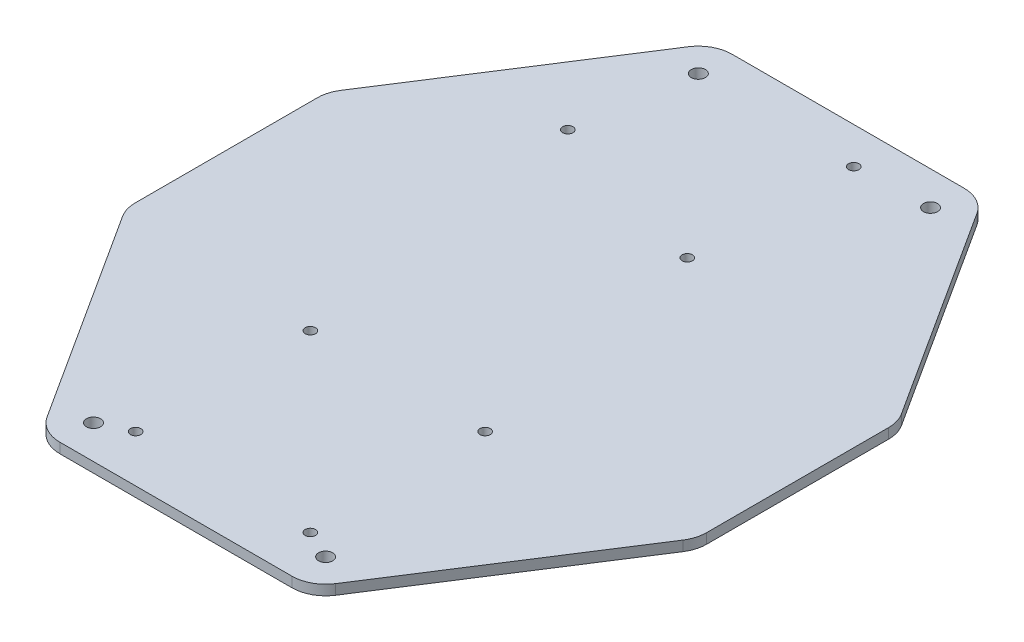
ISO-10303-21;
HEADER;
FILE_DESCRIPTION(('STEP AP214'),'2;1');
FILE_NAME('part.step','',(''),(''),'','','');
FILE_SCHEMA(('AUTOMOTIVE_DESIGN { 1 0 10303 214 1 1 1 1 }'));
ENDSEC;
DATA;
#1=APPLICATION_CONTEXT('core data for automotive mechanical design processes');
#2=APPLICATION_PROTOCOL_DEFINITION('international standard','automotive_design',2000,#1);
#3=PRODUCT_CONTEXT('',#1,'mechanical');
#4=PRODUCT('Part','Part','',(#3));
#5=PRODUCT_RELATED_PRODUCT_CATEGORY('part','',(#4));
#6=PRODUCT_DEFINITION_FORMATION('','',#4);
#7=PRODUCT_DEFINITION_CONTEXT('part definition',#1,'design');
#8=PRODUCT_DEFINITION('design','',#6,#7);
#9=PRODUCT_DEFINITION_SHAPE('','',#8);
#10=(LENGTH_UNIT() NAMED_UNIT(*) SI_UNIT(.MILLI.,.METRE.));
#11=(NAMED_UNIT(*) PLANE_ANGLE_UNIT() SI_UNIT($,.RADIAN.));
#12=(NAMED_UNIT(*) SI_UNIT($,.STERADIAN.) SOLID_ANGLE_UNIT());
#13=UNCERTAINTY_MEASURE_WITH_UNIT(LENGTH_MEASURE(1.E-05),#10,'distance_accuracy_value','');
#14=(GEOMETRIC_REPRESENTATION_CONTEXT(3) GLOBAL_UNCERTAINTY_ASSIGNED_CONTEXT((#13)) GLOBAL_UNIT_ASSIGNED_CONTEXT((#10,
#11,#12)) REPRESENTATION_CONTEXT('',''));
#15=CARTESIAN_POINT('',(0.,0.,0.));
#16=DIRECTION('',(0.,0.,1.));
#17=DIRECTION('',(1.,0.,0.));
#18=AXIS2_PLACEMENT_3D('',#15,#16,#17);
#19=CARTESIAN_POINT('',(-75.,3.,-32.9370188634369));
#20=DIRECTION('',(0.,1.,0.));
#21=DIRECTION('',(0.,0.,1.));
#22=AXIS2_PLACEMENT_3D('',#19,#20,#21);
#23=PLANE('',#22);
#24=CARTESIAN_POINT('',(34.5404878735048,3.,-150.));
#25=DIRECTION('',(0.,1.,0.));
#26=DIRECTION('',(0.,0.,1.));
#27=AXIS2_PLACEMENT_3D('',#24,#25,#26);
#28=CIRCLE('',#27,2.09999999999999);
#29=CARTESIAN_POINT('',(34.5404878735048,3.,-147.9));
#30=VERTEX_POINT('',#29);
#31=EDGE_CURVE('E430',#30,#30,#28,.T.);
#32=ORIENTED_EDGE('',*,*,#31,.F.);
#33=EDGE_LOOP('',(#32));
#34=FACE_BOUND('',#33,.T.);
#35=CARTESIAN_POINT('',(-34.5404878735048,3.,30.));
#36=DIRECTION('',(0.,1.,0.));
#37=DIRECTION('',(0.,0.,1.));
#38=AXIS2_PLACEMENT_3D('',#35,#36,#37);
#39=CIRCLE('',#38,2.1);
#40=CARTESIAN_POINT('',(-34.5404878735048,3.,32.1));
#41=VERTEX_POINT('',#40);
#42=EDGE_CURVE('E446',#41,#41,#39,.T.);
#43=ORIENTED_EDGE('',*,*,#42,.F.);
#44=EDGE_LOOP('',(#43));
#45=FACE_BOUND('',#44,.T.);
#46=CARTESIAN_POINT('',(11.3,3.,-100.87));
#47=DIRECTION('',(0.,1.,0.));
#48=DIRECTION('',(0.,0.,1.));
#49=AXIS2_PLACEMENT_3D('',#46,#47,#48);
#50=CIRCLE('',#49,1.55);
#51=CARTESIAN_POINT('',(11.3,3.,-99.32));
#52=VERTEX_POINT('',#51);
#53=EDGE_CURVE('E462',#52,#52,#50,.T.);
#54=ORIENTED_EDGE('',*,*,#53,.F.);
#55=EDGE_LOOP('',(#54));
#56=FACE_BOUND('',#55,.T.);
#57=CARTESIAN_POINT('',(-26.0000000000003,3.,25.9999999999997));
#58=DIRECTION('',(0.,1.,0.));
#59=DIRECTION('',(0.,0.,1.));
#60=AXIS2_PLACEMENT_3D('',#57,#58,#59);
#61=CIRCLE('',#60,1.55);
#62=CARTESIAN_POINT('',(-26.0000000000003,3.,27.5499999999997));
#63=VERTEX_POINT('',#62);
#64=EDGE_CURVE('E478',#63,#63,#61,.T.);
#65=ORIENTED_EDGE('',*,*,#64,.F.);
#66=EDGE_LOOP('',(#65));
#67=FACE_BOUND('',#66,.T.);
#68=CARTESIAN_POINT('',(26.0000000000001,3.,-25.9999999999999));
#69=DIRECTION('',(0.,1.,0.));
#70=DIRECTION('',(0.,0.,1.));
#71=AXIS2_PLACEMENT_3D('',#68,#69,#70);
#72=CIRCLE('',#71,1.55);
#73=CARTESIAN_POINT('',(26.0000000000001,3.,-24.4499999999999));
#74=VERTEX_POINT('',#73);
#75=EDGE_CURVE('E494',#74,#74,#72,.T.);
#76=ORIENTED_EDGE('',*,*,#75,.F.);
#77=EDGE_LOOP('',(#76));
#78=FACE_BOUND('',#77,.T.);
#79=CARTESIAN_POINT('',(-75.,3.,-32.9370188634369));
#80=DIRECTION('',(0.,1.,0.));
#81=DIRECTION('',(0.,0.,1.));
#82=AXIS2_PLACEMENT_3D('',#79,#80,#81);
#83=CIRCLE('',#82,10.);
#84=CARTESIAN_POINT('',(-85.,3.,-32.937018863437));
#85=VERTEX_POINT('',#84);
#86=CARTESIAN_POINT('',(-83.4117847537655,3.,-27.5294429503019));
#87=VERTEX_POINT('',#86);
#88=EDGE_CURVE('E242',#85,#87,#83,.T.);
#89=ORIENTED_EDGE('',*,*,#88,.T.);
#90=DIRECTION('',(0.540757591313499,0.,0.841178475376554));
#91=VECTOR('',#90,1.);
#92=CARTESIAN_POINT('',(-83.4117847537655,3.,-27.5294429503019));
#93=LINE('',#92,#91);
#94=CARTESIAN_POINT('',(-42.9522726272704,3.,35.407575913135));
#95=VERTEX_POINT('',#94);
#96=EDGE_CURVE('E130',#87,#95,#93,.T.);
#97=ORIENTED_EDGE('',*,*,#96,.T.);
#98=CARTESIAN_POINT('',(-34.5404878735048,3.,30.));
#99=DIRECTION('',(0.,1.,0.));
#100=DIRECTION('',(0.,0.,-1.));
#101=AXIS2_PLACEMENT_3D('',#98,#99,#100);
#102=CIRCLE('',#101,10.);
#103=CARTESIAN_POINT('',(-34.5404878735048,3.,40.));
#104=VERTEX_POINT('',#103);
#105=EDGE_CURVE('E295',#95,#104,#102,.T.);
#106=ORIENTED_EDGE('',*,*,#105,.T.);
#107=DIRECTION('',(1.,0.,0.));
#108=VECTOR('',#107,1.);
#109=CARTESIAN_POINT('',(-34.5404878735048,3.,40.));
#110=LINE('',#109,#108);
#111=CARTESIAN_POINT('',(34.5404878735048,3.,40.));
#112=VERTEX_POINT('',#111);
#113=EDGE_CURVE('E315',#104,#112,#110,.T.);
#114=ORIENTED_EDGE('',*,*,#113,.T.);
#115=CARTESIAN_POINT('',(34.5404878735048,3.,30.));
#116=DIRECTION('',(0.,1.,0.));
#117=DIRECTION('',(0.,0.,1.));
#118=AXIS2_PLACEMENT_3D('',#115,#116,#117);
#119=CIRCLE('',#118,10.);
#120=CARTESIAN_POINT('',(42.9522726272704,3.,35.407575913135));
#121=VERTEX_POINT('',#120);
#122=EDGE_CURVE('E311',#112,#121,#119,.T.);
#123=ORIENTED_EDGE('',*,*,#122,.T.);
#124=DIRECTION('',(0.540757591313499,0.,-0.841178475376554));
#125=VECTOR('',#124,1.);
#126=CARTESIAN_POINT('',(83.4117847537655,3.,-27.5294429503019));
#127=LINE('',#126,#125);
#128=CARTESIAN_POINT('',(83.4117847537655,3.,-27.5294429503019));
#129=VERTEX_POINT('',#128);
#130=EDGE_CURVE('E314',#121,#129,#127,.T.);
#131=ORIENTED_EDGE('',*,*,#130,.T.);
#132=CARTESIAN_POINT('',(75.,3.,-32.9370188634369));
#133=DIRECTION('',(0.,1.,0.));
#134=DIRECTION('',(0.,0.,-1.));
#135=AXIS2_PLACEMENT_3D('',#132,#133,#134);
#136=CIRCLE('',#135,10.);
#137=CARTESIAN_POINT('',(85.,3.,-32.937018863437));
#138=VERTEX_POINT('',#137);
#139=EDGE_CURVE('E319',#129,#138,#136,.T.);
#140=ORIENTED_EDGE('',*,*,#139,.T.);
#141=DIRECTION('',(0.,0.,-1.));
#142=VECTOR('',#141,1.);
#143=CARTESIAN_POINT('',(85.,3.,-32.937018863437));
#144=LINE('',#143,#142);
#145=CARTESIAN_POINT('',(85.,3.,-87.062981136563));
#146=VERTEX_POINT('',#145);
#147=EDGE_CURVE('E326',#138,#146,#144,.T.);
#148=ORIENTED_EDGE('',*,*,#147,.T.);
#149=CARTESIAN_POINT('',(75.,3.,-87.0629811365631));
#150=DIRECTION('',(0.,1.,0.));
#151=DIRECTION('',(0.,0.,1.));
#152=AXIS2_PLACEMENT_3D('',#149,#150,#151);
#153=CIRCLE('',#152,10.);
#154=CARTESIAN_POINT('',(83.4117847537655,3.,-92.4705570496981));
#155=VERTEX_POINT('',#154);
#156=EDGE_CURVE('E329',#146,#155,#153,.T.);
#157=ORIENTED_EDGE('',*,*,#156,.T.);
#158=DIRECTION('',(-0.540757591313499,0.,-0.841178475376554));
#159=VECTOR('',#158,1.);
#160=CARTESIAN_POINT('',(42.9522726272704,3.,-155.407575913135));
#161=LINE('',#160,#159);
#162=CARTESIAN_POINT('',(42.9522726272704,3.,-155.407575913135));
#163=VERTEX_POINT('',#162);
#164=EDGE_CURVE('E332',#155,#163,#161,.T.);
#165=ORIENTED_EDGE('',*,*,#164,.T.);
#166=CARTESIAN_POINT('',(34.5404878735048,3.,-150.));
#167=DIRECTION('',(0.,1.,0.));
#168=DIRECTION('',(0.,0.,-1.));
#169=AXIS2_PLACEMENT_3D('',#166,#167,#168);
#170=CIRCLE('',#169,10.);
#171=CARTESIAN_POINT('',(34.5404878735048,3.,-160.));
#172=VERTEX_POINT('',#171);
#173=EDGE_CURVE('E335',#163,#172,#170,.T.);
#174=ORIENTED_EDGE('',*,*,#173,.T.);
#175=DIRECTION('',(-1.,0.,0.));
#176=VECTOR('',#175,1.);
#177=CARTESIAN_POINT('',(-34.5404878735048,3.,-160.));
#178=LINE('',#177,#176);
#179=CARTESIAN_POINT('',(-34.5404878735048,3.,-160.));
#180=VERTEX_POINT('',#179);
#181=EDGE_CURVE('E338',#172,#180,#178,.T.);
#182=ORIENTED_EDGE('',*,*,#181,.T.);
#183=CARTESIAN_POINT('',(-34.5404878735048,3.,-150.));
#184=DIRECTION('',(0.,1.,0.));
#185=DIRECTION('',(0.,0.,1.));
#186=AXIS2_PLACEMENT_3D('',#183,#184,#185);
#187=CIRCLE('',#186,10.);
#188=CARTESIAN_POINT('',(-42.9522726272704,3.,-155.407575913135));
#189=VERTEX_POINT('',#188);
#190=EDGE_CURVE('E173',#180,#189,#187,.T.);
#191=ORIENTED_EDGE('',*,*,#190,.T.);
#192=DIRECTION('',(-0.540757591313499,0.,0.841178475376554));
#193=VECTOR('',#192,1.);
#194=CARTESIAN_POINT('',(-42.9522726272704,3.,-155.407575913135));
#195=LINE('',#194,#193);
#196=CARTESIAN_POINT('',(-83.4117847537655,3.,-92.4705570496981));
#197=VERTEX_POINT('',#196);
#198=EDGE_CURVE('E167',#189,#197,#195,.T.);
#199=ORIENTED_EDGE('',*,*,#198,.T.);
#200=CARTESIAN_POINT('',(-75.,3.,-87.0629811365631));
#201=DIRECTION('',(0.,1.,0.));
#202=DIRECTION('',(0.,0.,-1.));
#203=AXIS2_PLACEMENT_3D('',#200,#201,#202);
#204=CIRCLE('',#203,10.);
#205=CARTESIAN_POINT('',(-85.,3.,-87.062981136563));
#206=VERTEX_POINT('',#205);
#207=EDGE_CURVE('E171',#197,#206,#204,.T.);
#208=ORIENTED_EDGE('',*,*,#207,.T.);
#209=DIRECTION('',(0.,0.,1.));
#210=VECTOR('',#209,1.);
#211=CARTESIAN_POINT('',(-85.,3.,-32.937018863437));
#212=LINE('',#211,#210);
#213=EDGE_CURVE('E63',#206,#85,#212,.T.);
#214=ORIENTED_EDGE('',*,*,#213,.T.);
#215=EDGE_LOOP('',(#89,#97,#106,#114,#123,#131,#140,#148,#157,#165,#174,#182,#191,#199,#208,#214));
#216=FACE_BOUND('',#215,.T.);
#217=CARTESIAN_POINT('',(-26.,3.,-26.));
#218=DIRECTION('',(0.,1.,0.));
#219=DIRECTION('',(0.,0.,1.));
#220=AXIS2_PLACEMENT_3D('',#217,#218,#219);
#221=CIRCLE('',#220,1.55);
#222=CARTESIAN_POINT('',(-26.,3.,-24.45));
#223=VERTEX_POINT('',#222);
#224=EDGE_CURVE('E200',#223,#223,#221,.T.);
#225=ORIENTED_EDGE('',*,*,#224,.F.);
#226=EDGE_LOOP('',(#225));
#227=FACE_BOUND('',#226,.T.);
#228=CARTESIAN_POINT('',(25.9999999999998,3.,26.0000000000002));
#229=DIRECTION('',(0.,1.,0.));
#230=DIRECTION('',(0.,0.,1.));
#231=AXIS2_PLACEMENT_3D('',#228,#229,#230);
#232=CIRCLE('',#231,1.55);
#233=CARTESIAN_POINT('',(25.9999999999998,3.,27.5500000000002));
#234=VERTEX_POINT('',#233);
#235=EDGE_CURVE('E486',#234,#234,#232,.T.);
#236=ORIENTED_EDGE('',*,*,#235,.F.);
#237=EDGE_LOOP('',(#236));
#238=FACE_BOUND('',#237,.T.);
#239=CARTESIAN_POINT('',(-39.5,3.,-116.11));
#240=DIRECTION('',(0.,1.,0.));
#241=DIRECTION('',(0.,0.,1.));
#242=AXIS2_PLACEMENT_3D('',#239,#240,#241);
#243=CIRCLE('',#242,1.54999999999999);
#244=CARTESIAN_POINT('',(-39.5,3.,-114.56));
#245=VERTEX_POINT('',#244);
#246=EDGE_CURVE('E470',#245,#245,#243,.T.);
#247=ORIENTED_EDGE('',*,*,#246,.F.);
#248=EDGE_LOOP('',(#247));
#249=FACE_BOUND('',#248,.T.);
#250=CARTESIAN_POINT('',(12.57,3.,-149.13));
#251=DIRECTION('',(0.,1.,0.));
#252=DIRECTION('',(0.,0.,1.));
#253=AXIS2_PLACEMENT_3D('',#250,#251,#252);
#254=CIRCLE('',#253,1.54999999999999);
#255=CARTESIAN_POINT('',(12.57,3.,-147.58));
#256=VERTEX_POINT('',#255);
#257=EDGE_CURVE('E454',#256,#256,#254,.T.);
#258=ORIENTED_EDGE('',*,*,#257,.F.);
#259=EDGE_LOOP('',(#258));
#260=FACE_BOUND('',#259,.T.);
#261=CARTESIAN_POINT('',(34.5404878735048,3.,30.));
#262=DIRECTION('',(0.,1.,0.));
#263=DIRECTION('',(0.,0.,1.));
#264=AXIS2_PLACEMENT_3D('',#261,#262,#263);
#265=CIRCLE('',#264,2.1);
#266=CARTESIAN_POINT('',(34.5404878735048,3.,32.1));
#267=VERTEX_POINT('',#266);
#268=EDGE_CURVE('E438',#267,#267,#265,.T.);
#269=ORIENTED_EDGE('',*,*,#268,.F.);
#270=EDGE_LOOP('',(#269));
#271=FACE_BOUND('',#270,.T.);
#272=CARTESIAN_POINT('',(-34.5404878735048,3.,-150.));
#273=DIRECTION('',(0.,1.,0.));
#274=DIRECTION('',(0.,0.,1.));
#275=AXIS2_PLACEMENT_3D('',#272,#273,#274);
#276=CIRCLE('',#275,2.09999999999999);
#277=CARTESIAN_POINT('',(-34.5404878735048,3.,-147.9));
#278=VERTEX_POINT('',#277);
#279=EDGE_CURVE('E419',#278,#278,#276,.T.);
#280=ORIENTED_EDGE('',*,*,#279,.F.);
#281=EDGE_LOOP('',(#280));
#282=FACE_BOUND('',#281,.T.);
#283=ADVANCED_FACE('F45',(#34,#45,#56,#67,#78,#216,#227,#238,#249,#260,#271,#282),#23,.T.);
#284=CARTESIAN_POINT('',(-75.,0.,-32.9370188634369));
#285=DIRECTION('',(0.,1.,0.));
#286=DIRECTION('',(0.,0.,1.));
#287=AXIS2_PLACEMENT_3D('',#284,#285,#286);
#288=PLANE('',#287);
#289=CARTESIAN_POINT('',(-75.,0.,-32.9370188634369));
#290=DIRECTION('',(0.,1.,0.));
#291=DIRECTION('',(0.,0.,1.));
#292=AXIS2_PLACEMENT_3D('',#289,#290,#291);
#293=CIRCLE('',#292,10.);
#294=CARTESIAN_POINT('',(-85.,0.,-32.937018863437));
#295=VERTEX_POINT('',#294);
#296=CARTESIAN_POINT('',(-83.4117847537655,0.,-27.5294429503019));
#297=VERTEX_POINT('',#296);
#298=EDGE_CURVE('E195',#295,#297,#293,.T.);
#299=ORIENTED_EDGE('',*,*,#298,.F.);
#300=DIRECTION('',(0.,0.,1.));
#301=VECTOR('',#300,1.);
#302=CARTESIAN_POINT('',(-85.,0.,-32.937018863437));
#303=LINE('',#302,#301);
#304=CARTESIAN_POINT('',(-85.,0.,-87.062981136563));
#305=VERTEX_POINT('',#304);
#306=EDGE_CURVE('E122',#305,#295,#303,.T.);
#307=ORIENTED_EDGE('',*,*,#306,.F.);
#308=CARTESIAN_POINT('',(-75.,0.,-87.0629811365631));
#309=DIRECTION('',(0.,1.,0.));
#310=DIRECTION('',(0.,0.,-1.));
#311=AXIS2_PLACEMENT_3D('',#308,#309,#310);
#312=CIRCLE('',#311,10.);
#313=CARTESIAN_POINT('',(-83.4117847537655,0.,-92.4705570496981));
#314=VERTEX_POINT('',#313);
#315=EDGE_CURVE('E116',#314,#305,#312,.T.);
#316=ORIENTED_EDGE('',*,*,#315,.F.);
#317=DIRECTION('',(-0.540757591313499,0.,0.841178475376554));
#318=VECTOR('',#317,1.);
#319=CARTESIAN_POINT('',(-42.9522726272704,0.,-155.407575913135));
#320=LINE('',#319,#318);
#321=CARTESIAN_POINT('',(-42.9522726272704,0.,-155.407575913135));
#322=VERTEX_POINT('',#321);
#323=EDGE_CURVE('E182',#322,#314,#320,.T.);
#324=ORIENTED_EDGE('',*,*,#323,.F.);
#325=CARTESIAN_POINT('',(-34.5404878735048,0.,-150.));
#326=DIRECTION('',(0.,1.,0.));
#327=DIRECTION('',(0.,0.,1.));
#328=AXIS2_PLACEMENT_3D('',#325,#326,#327);
#329=CIRCLE('',#328,10.);
#330=CARTESIAN_POINT('',(-34.5404878735048,0.,-160.));
#331=VERTEX_POINT('',#330);
#332=EDGE_CURVE('E233',#331,#322,#329,.T.);
#333=ORIENTED_EDGE('',*,*,#332,.F.);
#334=DIRECTION('',(-1.,0.,0.));
#335=VECTOR('',#334,1.);
#336=CARTESIAN_POINT('',(-34.5404878735048,0.,-160.));
#337=LINE('',#336,#335);
#338=CARTESIAN_POINT('',(34.5404878735048,0.,-160.));
#339=VERTEX_POINT('',#338);
#340=EDGE_CURVE('E230',#339,#331,#337,.T.);
#341=ORIENTED_EDGE('',*,*,#340,.F.);
#342=CARTESIAN_POINT('',(34.5404878735048,0.,-150.));
#343=DIRECTION('',(0.,1.,0.));
#344=DIRECTION('',(0.,0.,-1.));
#345=AXIS2_PLACEMENT_3D('',#342,#343,#344);
#346=CIRCLE('',#345,10.);
#347=CARTESIAN_POINT('',(42.9522726272704,0.,-155.407575913135));
#348=VERTEX_POINT('',#347);
#349=EDGE_CURVE('E227',#348,#339,#346,.T.);
#350=ORIENTED_EDGE('',*,*,#349,.F.);
#351=DIRECTION('',(-0.540757591313499,0.,-0.841178475376554));
#352=VECTOR('',#351,1.);
#353=CARTESIAN_POINT('',(42.9522726272704,0.,-155.407575913135));
#354=LINE('',#353,#352);
#355=CARTESIAN_POINT('',(83.4117847537655,0.,-92.4705570496981));
#356=VERTEX_POINT('',#355);
#357=EDGE_CURVE('E224',#356,#348,#354,.T.);
#358=ORIENTED_EDGE('',*,*,#357,.F.);
#359=CARTESIAN_POINT('',(75.,0.,-87.0629811365631));
#360=DIRECTION('',(0.,1.,0.));
#361=DIRECTION('',(0.,0.,1.));
#362=AXIS2_PLACEMENT_3D('',#359,#360,#361);
#363=CIRCLE('',#362,10.);
#364=CARTESIAN_POINT('',(85.,0.,-87.062981136563));
#365=VERTEX_POINT('',#364);
#366=EDGE_CURVE('E221',#365,#356,#363,.T.);
#367=ORIENTED_EDGE('',*,*,#366,.F.);
#368=DIRECTION('',(0.,0.,-1.));
#369=VECTOR('',#368,1.);
#370=CARTESIAN_POINT('',(85.,0.,-32.937018863437));
#371=LINE('',#370,#369);
#372=CARTESIAN_POINT('',(85.,0.,-32.937018863437));
#373=VERTEX_POINT('',#372);
#374=EDGE_CURVE('E218',#373,#365,#371,.T.);
#375=ORIENTED_EDGE('',*,*,#374,.F.);
#376=CARTESIAN_POINT('',(75.,0.,-32.9370188634369));
#377=DIRECTION('',(0.,1.,0.));
#378=DIRECTION('',(0.,0.,-1.));
#379=AXIS2_PLACEMENT_3D('',#376,#377,#378);
#380=CIRCLE('',#379,10.);
#381=CARTESIAN_POINT('',(83.4117847537655,0.,-27.5294429503019));
#382=VERTEX_POINT('',#381);
#383=EDGE_CURVE('E215',#382,#373,#380,.T.);
#384=ORIENTED_EDGE('',*,*,#383,.F.);
#385=DIRECTION('',(0.540757591313499,0.,-0.841178475376554));
#386=VECTOR('',#385,1.);
#387=CARTESIAN_POINT('',(83.4117847537655,0.,-27.5294429503019));
#388=LINE('',#387,#386);
#389=CARTESIAN_POINT('',(42.9522726272704,0.,35.407575913135));
#390=VERTEX_POINT('',#389);
#391=EDGE_CURVE('E212',#390,#382,#388,.T.);
#392=ORIENTED_EDGE('',*,*,#391,.F.);
#393=CARTESIAN_POINT('',(34.5404878735048,0.,30.));
#394=DIRECTION('',(0.,1.,0.));
#395=DIRECTION('',(0.,0.,1.));
#396=AXIS2_PLACEMENT_3D('',#393,#394,#395);
#397=CIRCLE('',#396,10.);
#398=CARTESIAN_POINT('',(34.5404878735048,0.,40.));
#399=VERTEX_POINT('',#398);
#400=EDGE_CURVE('E209',#399,#390,#397,.T.);
#401=ORIENTED_EDGE('',*,*,#400,.F.);
#402=DIRECTION('',(1.,0.,0.));
#403=VECTOR('',#402,1.);
#404=CARTESIAN_POINT('',(-34.5404878735048,0.,40.));
#405=LINE('',#404,#403);
#406=CARTESIAN_POINT('',(-34.5404878735048,0.,40.));
#407=VERTEX_POINT('',#406);
#408=EDGE_CURVE('E206',#407,#399,#405,.T.);
#409=ORIENTED_EDGE('',*,*,#408,.F.);
#410=CARTESIAN_POINT('',(-34.5404878735048,0.,30.));
#411=DIRECTION('',(0.,1.,0.));
#412=DIRECTION('',(0.,0.,-1.));
#413=AXIS2_PLACEMENT_3D('',#410,#411,#412);
#414=CIRCLE('',#413,10.);
#415=CARTESIAN_POINT('',(-42.9522726272704,0.,35.407575913135));
#416=VERTEX_POINT('',#415);
#417=EDGE_CURVE('E203',#416,#407,#414,.T.);
#418=ORIENTED_EDGE('',*,*,#417,.F.);
#419=DIRECTION('',(0.540757591313499,0.,0.841178475376554));
#420=VECTOR('',#419,1.);
#421=CARTESIAN_POINT('',(-83.4117847537655,0.,-27.5294429503019));
#422=LINE('',#421,#420);
#423=EDGE_CURVE('E199',#297,#416,#422,.T.);
#424=ORIENTED_EDGE('',*,*,#423,.F.);
#425=EDGE_LOOP('',(#299,#307,#316,#324,#333,#341,#350,#358,#367,#375,#384,#392,#401,#409,#418,#424));
#426=FACE_BOUND('',#425,.T.);
#427=CARTESIAN_POINT('',(-26.,0.,-26.));
#428=DIRECTION('',(0.,1.,0.));
#429=DIRECTION('',(0.,0.,1.));
#430=AXIS2_PLACEMENT_3D('',#427,#428,#429);
#431=CIRCLE('',#430,1.55);
#432=CARTESIAN_POINT('',(-26.,0.,-24.45));
#433=VERTEX_POINT('',#432);
#434=EDGE_CURVE('E498',#433,#433,#431,.T.);
#435=ORIENTED_EDGE('',*,*,#434,.T.);
#436=EDGE_LOOP('',(#435));
#437=FACE_BOUND('',#436,.T.);
#438=CARTESIAN_POINT('',(26.0000000000001,0.,-25.9999999999999));
#439=DIRECTION('',(0.,1.,0.));
#440=DIRECTION('',(0.,0.,1.));
#441=AXIS2_PLACEMENT_3D('',#438,#439,#440);
#442=CIRCLE('',#441,1.55);
#443=CARTESIAN_POINT('',(26.0000000000001,0.,-24.4499999999999));
#444=VERTEX_POINT('',#443);
#445=EDGE_CURVE('E490',#444,#444,#442,.T.);
#446=ORIENTED_EDGE('',*,*,#445,.T.);
#447=EDGE_LOOP('',(#446));
#448=FACE_BOUND('',#447,.T.);
#449=CARTESIAN_POINT('',(25.9999999999998,0.,26.0000000000002));
#450=DIRECTION('',(0.,1.,0.));
#451=DIRECTION('',(0.,0.,1.));
#452=AXIS2_PLACEMENT_3D('',#449,#450,#451);
#453=CIRCLE('',#452,1.55);
#454=CARTESIAN_POINT('',(25.9999999999998,0.,27.5500000000002));
#455=VERTEX_POINT('',#454);
#456=EDGE_CURVE('E482',#455,#455,#453,.T.);
#457=ORIENTED_EDGE('',*,*,#456,.T.);
#458=EDGE_LOOP('',(#457));
#459=FACE_BOUND('',#458,.T.);
#460=CARTESIAN_POINT('',(-26.0000000000003,0.,25.9999999999997));
#461=DIRECTION('',(0.,1.,0.));
#462=DIRECTION('',(0.,0.,1.));
#463=AXIS2_PLACEMENT_3D('',#460,#461,#462);
#464=CIRCLE('',#463,1.55);
#465=CARTESIAN_POINT('',(-26.0000000000003,0.,27.5499999999997));
#466=VERTEX_POINT('',#465);
#467=EDGE_CURVE('E474',#466,#466,#464,.T.);
#468=ORIENTED_EDGE('',*,*,#467,.T.);
#469=EDGE_LOOP('',(#468));
#470=FACE_BOUND('',#469,.T.);
#471=CARTESIAN_POINT('',(-39.5,0.,-116.11));
#472=DIRECTION('',(0.,1.,0.));
#473=DIRECTION('',(0.,0.,1.));
#474=AXIS2_PLACEMENT_3D('',#471,#472,#473);
#475=CIRCLE('',#474,1.54999999999999);
#476=CARTESIAN_POINT('',(-39.5,0.,-114.56));
#477=VERTEX_POINT('',#476);
#478=EDGE_CURVE('E466',#477,#477,#475,.T.);
#479=ORIENTED_EDGE('',*,*,#478,.T.);
#480=EDGE_LOOP('',(#479));
#481=FACE_BOUND('',#480,.T.);
#482=CARTESIAN_POINT('',(11.3,0.,-100.87));
#483=DIRECTION('',(0.,1.,0.));
#484=DIRECTION('',(0.,0.,1.));
#485=AXIS2_PLACEMENT_3D('',#482,#483,#484);
#486=CIRCLE('',#485,1.55);
#487=CARTESIAN_POINT('',(11.3,0.,-99.32));
#488=VERTEX_POINT('',#487);
#489=EDGE_CURVE('E458',#488,#488,#486,.T.);
#490=ORIENTED_EDGE('',*,*,#489,.T.);
#491=EDGE_LOOP('',(#490));
#492=FACE_BOUND('',#491,.T.);
#493=CARTESIAN_POINT('',(12.57,0.,-149.13));
#494=DIRECTION('',(0.,1.,0.));
#495=DIRECTION('',(0.,0.,1.));
#496=AXIS2_PLACEMENT_3D('',#493,#494,#495);
#497=CIRCLE('',#496,1.54999999999999);
#498=CARTESIAN_POINT('',(12.57,0.,-147.58));
#499=VERTEX_POINT('',#498);
#500=EDGE_CURVE('E450',#499,#499,#497,.T.);
#501=ORIENTED_EDGE('',*,*,#500,.T.);
#502=EDGE_LOOP('',(#501));
#503=FACE_BOUND('',#502,.T.);
#504=CARTESIAN_POINT('',(-34.5404878735048,0.,30.));
#505=DIRECTION('',(0.,1.,0.));
#506=DIRECTION('',(0.,0.,1.));
#507=AXIS2_PLACEMENT_3D('',#504,#505,#506);
#508=CIRCLE('',#507,2.1);
#509=CARTESIAN_POINT('',(-34.5404878735048,0.,32.1));
#510=VERTEX_POINT('',#509);
#511=EDGE_CURVE('E442',#510,#510,#508,.T.);
#512=ORIENTED_EDGE('',*,*,#511,.T.);
#513=EDGE_LOOP('',(#512));
#514=FACE_BOUND('',#513,.T.);
#515=CARTESIAN_POINT('',(34.5404878735048,0.,30.));
#516=DIRECTION('',(0.,1.,0.));
#517=DIRECTION('',(0.,0.,1.));
#518=AXIS2_PLACEMENT_3D('',#515,#516,#517);
#519=CIRCLE('',#518,2.1);
#520=CARTESIAN_POINT('',(34.5404878735048,0.,32.1));
#521=VERTEX_POINT('',#520);
#522=EDGE_CURVE('E434',#521,#521,#519,.T.);
#523=ORIENTED_EDGE('',*,*,#522,.T.);
#524=EDGE_LOOP('',(#523));
#525=FACE_BOUND('',#524,.T.);
#526=CARTESIAN_POINT('',(34.5404878735048,0.,-150.));
#527=DIRECTION('',(0.,1.,0.));
#528=DIRECTION('',(0.,0.,1.));
#529=AXIS2_PLACEMENT_3D('',#526,#527,#528);
#530=CIRCLE('',#529,2.09999999999999);
#531=CARTESIAN_POINT('',(34.5404878735048,0.,-147.9));
#532=VERTEX_POINT('',#531);
#533=EDGE_CURVE('E427',#532,#532,#530,.T.);
#534=ORIENTED_EDGE('',*,*,#533,.T.);
#535=EDGE_LOOP('',(#534));
#536=FACE_BOUND('',#535,.T.);
#537=CARTESIAN_POINT('',(-34.5404878735048,0.,-150.));
#538=DIRECTION('',(0.,1.,0.));
#539=DIRECTION('',(0.,0.,1.));
#540=AXIS2_PLACEMENT_3D('',#537,#538,#539);
#541=CIRCLE('',#540,2.09999999999999);
#542=CARTESIAN_POINT('',(-34.5404878735048,0.,-147.9));
#543=VERTEX_POINT('',#542);
#544=EDGE_CURVE('E422',#543,#543,#541,.T.);
#545=ORIENTED_EDGE('',*,*,#544,.T.);
#546=EDGE_LOOP('',(#545));
#547=FACE_BOUND('',#546,.T.);
#548=ADVANCED_FACE('F299',(#426,#437,#448,#459,#470,#481,#492,#503,#514,#525,#536,#547),#288,.F.);
#549=CARTESIAN_POINT('',(-75.,3.,-32.9370188634369));
#550=DIRECTION('',(0.,-1.,0.));
#551=DIRECTION('',(0.,0.,-1.));
#552=AXIS2_PLACEMENT_3D('',#549,#550,#551);
#553=CYLINDRICAL_SURFACE('',#552,10.);
#554=ORIENTED_EDGE('',*,*,#298,.T.);
#555=DIRECTION('',(0.,-1.,0.));
#556=VECTOR('',#555,1.);
#557=CARTESIAN_POINT('',(-83.4117847537655,3.,-27.5294429503019));
#558=LINE('',#557,#556);
#559=EDGE_CURVE('E11',#87,#297,#558,.T.);
#560=ORIENTED_EDGE('',*,*,#559,.F.);
#561=ORIENTED_EDGE('',*,*,#88,.F.);
#562=DIRECTION('',(0.,-1.,0.));
#563=VECTOR('',#562,1.);
#564=CARTESIAN_POINT('',(-85.,3.,-32.937018863437));
#565=LINE('',#564,#563);
#566=EDGE_CURVE('E191',#85,#295,#565,.T.);
#567=ORIENTED_EDGE('',*,*,#566,.T.);
#568=EDGE_LOOP('',(#554,#560,#561,#567));
#569=FACE_BOUND('',#568,.T.);
#570=ADVANCED_FACE('F47',(#569),#553,.T.);
#571=CARTESIAN_POINT('',(-83.4117847537655,3.,-27.5294429503019));
#572=DIRECTION('',(0.841178475376554,0.,-0.540757591313499));
#573=DIRECTION('',(-0.540757591313499,0.,-0.841178475376554));
#574=AXIS2_PLACEMENT_3D('',#571,#572,#573);
#575=PLANE('',#574);
#576=ORIENTED_EDGE('',*,*,#423,.T.);
#577=DIRECTION('',(0.,-1.,0.));
#578=VECTOR('',#577,1.);
#579=CARTESIAN_POINT('',(-42.9522726272704,3.,35.407575913135));
#580=LINE('',#579,#578);
#581=EDGE_CURVE('E55',#95,#416,#580,.T.);
#582=ORIENTED_EDGE('',*,*,#581,.F.);
#583=ORIENTED_EDGE('',*,*,#96,.F.);
#584=ORIENTED_EDGE('',*,*,#559,.T.);
#585=EDGE_LOOP('',(#576,#582,#583,#584));
#586=FACE_BOUND('',#585,.T.);
#587=ADVANCED_FACE('F728',(#586),#575,.F.);
#588=CARTESIAN_POINT('',(-34.5404878735048,3.,30.));
#589=DIRECTION('',(0.,-1.,0.));
#590=DIRECTION('',(0.,0.,-1.));
#591=AXIS2_PLACEMENT_3D('',#588,#589,#590);
#592=CYLINDRICAL_SURFACE('',#591,10.);
#593=ORIENTED_EDGE('',*,*,#417,.T.);
#594=DIRECTION('',(0.,-1.,0.));
#595=VECTOR('',#594,1.);
#596=CARTESIAN_POINT('',(-34.5404878735048,3.,40.));
#597=LINE('',#596,#595);
#598=EDGE_CURVE('E285',#104,#407,#597,.T.);
#599=ORIENTED_EDGE('',*,*,#598,.F.);
#600=ORIENTED_EDGE('',*,*,#105,.F.);
#601=ORIENTED_EDGE('',*,*,#581,.T.);
#602=EDGE_LOOP('',(#593,#599,#600,#601));
#603=FACE_BOUND('',#602,.T.);
#604=ADVANCED_FACE('F293',(#603),#592,.T.);
#605=CARTESIAN_POINT('',(-34.5404878735048,3.,40.));
#606=DIRECTION('',(0.,0.,-1.));
#607=DIRECTION('',(-1.,0.,0.));
#608=AXIS2_PLACEMENT_3D('',#605,#606,#607);
#609=PLANE('',#608);
#610=ORIENTED_EDGE('',*,*,#408,.T.);
#611=DIRECTION('',(0.,-1.,0.));
#612=VECTOR('',#611,1.);
#613=CARTESIAN_POINT('',(34.5404878735048,3.,40.));
#614=LINE('',#613,#612);
#615=EDGE_CURVE('E281',#112,#399,#614,.T.);
#616=ORIENTED_EDGE('',*,*,#615,.F.);
#617=ORIENTED_EDGE('',*,*,#113,.F.);
#618=ORIENTED_EDGE('',*,*,#598,.T.);
#619=EDGE_LOOP('',(#610,#616,#617,#618));
#620=FACE_BOUND('',#619,.T.);
#621=ADVANCED_FACE('F305',(#620),#609,.F.);
#622=CARTESIAN_POINT('',(34.5404878735048,3.,30.));
#623=DIRECTION('',(0.,-1.,0.));
#624=DIRECTION('',(0.,0.,-1.));
#625=AXIS2_PLACEMENT_3D('',#622,#623,#624);
#626=CYLINDRICAL_SURFACE('',#625,10.);
#627=ORIENTED_EDGE('',*,*,#400,.T.);
#628=DIRECTION('',(0.,-1.,0.));
#629=VECTOR('',#628,1.);
#630=CARTESIAN_POINT('',(42.9522726272704,3.,35.407575913135));
#631=LINE('',#630,#629);
#632=EDGE_CURVE('E277',#121,#390,#631,.T.);
#633=ORIENTED_EDGE('',*,*,#632,.F.);
#634=ORIENTED_EDGE('',*,*,#122,.F.);
#635=ORIENTED_EDGE('',*,*,#615,.T.);
#636=EDGE_LOOP('',(#627,#633,#634,#635));
#637=FACE_BOUND('',#636,.T.);
#638=ADVANCED_FACE('F309',(#637),#626,.T.);
#639=CARTESIAN_POINT('',(83.4117847537655,3.,-27.5294429503019));
#640=DIRECTION('',(-0.841178475376554,0.,-0.540757591313499));
#641=DIRECTION('',(-0.540757591313499,0.,0.841178475376554));
#642=AXIS2_PLACEMENT_3D('',#639,#640,#641);
#643=PLANE('',#642);
#644=ORIENTED_EDGE('',*,*,#391,.T.);
#645=DIRECTION('',(0.,-1.,0.));
#646=VECTOR('',#645,1.);
#647=CARTESIAN_POINT('',(83.4117847537655,3.,-27.5294429503019));
#648=LINE('',#647,#646);
#649=EDGE_CURVE('E273',#129,#382,#648,.T.);
#650=ORIENTED_EDGE('',*,*,#649,.F.);
#651=ORIENTED_EDGE('',*,*,#130,.F.);
#652=ORIENTED_EDGE('',*,*,#632,.T.);
#653=EDGE_LOOP('',(#644,#650,#651,#652));
#654=FACE_BOUND('',#653,.T.);
#655=ADVANCED_FACE('F693',(#654),#643,.F.);
#656=CARTESIAN_POINT('',(75.,3.,-32.9370188634369));
#657=DIRECTION('',(0.,-1.,0.));
#658=DIRECTION('',(0.,0.,-1.));
#659=AXIS2_PLACEMENT_3D('',#656,#657,#658);
#660=CYLINDRICAL_SURFACE('',#659,10.);
#661=ORIENTED_EDGE('',*,*,#383,.T.);
#662=DIRECTION('',(0.,-1.,0.));
#663=VECTOR('',#662,1.);
#664=CARTESIAN_POINT('',(85.,3.,-32.937018863437));
#665=LINE('',#664,#663);
#666=EDGE_CURVE('E269',#138,#373,#665,.T.);
#667=ORIENTED_EDGE('',*,*,#666,.F.);
#668=ORIENTED_EDGE('',*,*,#139,.F.);
#669=ORIENTED_EDGE('',*,*,#649,.T.);
#670=EDGE_LOOP('',(#661,#667,#668,#669));
#671=FACE_BOUND('',#670,.T.);
#672=ADVANCED_FACE('F683',(#671),#660,.T.);
#673=CARTESIAN_POINT('',(85.,3.,-32.937018863437));
#674=DIRECTION('',(-1.,0.,0.));
#675=DIRECTION('',(0.,0.,1.));
#676=AXIS2_PLACEMENT_3D('',#673,#674,#675);
#677=PLANE('',#676);
#678=ORIENTED_EDGE('',*,*,#374,.T.);
#679=DIRECTION('',(0.,-1.,0.));
#680=VECTOR('',#679,1.);
#681=CARTESIAN_POINT('',(85.,3.,-87.062981136563));
#682=LINE('',#681,#680);
#683=EDGE_CURVE('E265',#146,#365,#682,.T.);
#684=ORIENTED_EDGE('',*,*,#683,.F.);
#685=ORIENTED_EDGE('',*,*,#147,.F.);
#686=ORIENTED_EDGE('',*,*,#666,.T.);
#687=EDGE_LOOP('',(#678,#684,#685,#686));
#688=FACE_BOUND('',#687,.T.);
#689=ADVANCED_FACE('F673',(#688),#677,.F.);
#690=CARTESIAN_POINT('',(75.,3.,-87.0629811365631));
#691=DIRECTION('',(0.,-1.,0.));
#692=DIRECTION('',(0.,0.,-1.));
#693=AXIS2_PLACEMENT_3D('',#690,#691,#692);
#694=CYLINDRICAL_SURFACE('',#693,10.);
#695=ORIENTED_EDGE('',*,*,#366,.T.);
#696=DIRECTION('',(0.,-1.,0.));
#697=VECTOR('',#696,1.);
#698=CARTESIAN_POINT('',(83.4117847537655,3.,-92.4705570496981));
#699=LINE('',#698,#697);
#700=EDGE_CURVE('E261',#155,#356,#699,.T.);
#701=ORIENTED_EDGE('',*,*,#700,.F.);
#702=ORIENTED_EDGE('',*,*,#156,.F.);
#703=ORIENTED_EDGE('',*,*,#683,.T.);
#704=EDGE_LOOP('',(#695,#701,#702,#703));
#705=FACE_BOUND('',#704,.T.);
#706=ADVANCED_FACE('F663',(#705),#694,.T.);
#707=CARTESIAN_POINT('',(42.9522726272704,3.,-155.407575913135));
#708=DIRECTION('',(-0.841178475376554,0.,0.540757591313499));
#709=DIRECTION('',(0.540757591313499,0.,0.841178475376554));
#710=AXIS2_PLACEMENT_3D('',#707,#708,#709);
#711=PLANE('',#710);
#712=ORIENTED_EDGE('',*,*,#357,.T.);
#713=DIRECTION('',(0.,-1.,0.));
#714=VECTOR('',#713,1.);
#715=CARTESIAN_POINT('',(42.9522726272704,3.,-155.407575913135));
#716=LINE('',#715,#714);
#717=EDGE_CURVE('E257',#163,#348,#716,.T.);
#718=ORIENTED_EDGE('',*,*,#717,.F.);
#719=ORIENTED_EDGE('',*,*,#164,.F.);
#720=ORIENTED_EDGE('',*,*,#700,.T.);
#721=EDGE_LOOP('',(#712,#718,#719,#720));
#722=FACE_BOUND('',#721,.T.);
#723=ADVANCED_FACE('F653',(#722),#711,.F.);
#724=CARTESIAN_POINT('',(34.5404878735048,3.,-150.));
#725=DIRECTION('',(0.,-1.,0.));
#726=DIRECTION('',(0.,0.,-1.));
#727=AXIS2_PLACEMENT_3D('',#724,#725,#726);
#728=CYLINDRICAL_SURFACE('',#727,10.);
#729=ORIENTED_EDGE('',*,*,#349,.T.);
#730=DIRECTION('',(0.,-1.,0.));
#731=VECTOR('',#730,1.);
#732=CARTESIAN_POINT('',(34.5404878735048,3.,-160.));
#733=LINE('',#732,#731);
#734=EDGE_CURVE('E253',#172,#339,#733,.T.);
#735=ORIENTED_EDGE('',*,*,#734,.F.);
#736=ORIENTED_EDGE('',*,*,#173,.F.);
#737=ORIENTED_EDGE('',*,*,#717,.T.);
#738=EDGE_LOOP('',(#729,#735,#736,#737));
#739=FACE_BOUND('',#738,.T.);
#740=ADVANCED_FACE('F644',(#739),#728,.T.);
#741=CARTESIAN_POINT('',(-34.5404878735048,3.,-160.));
#742=DIRECTION('',(0.,0.,1.));
#743=DIRECTION('',(1.,0.,0.));
#744=AXIS2_PLACEMENT_3D('',#741,#742,#743);
#745=PLANE('',#744);
#746=ORIENTED_EDGE('',*,*,#340,.T.);
#747=DIRECTION('',(0.,-1.,0.));
#748=VECTOR('',#747,1.);
#749=CARTESIAN_POINT('',(-34.5404878735048,3.,-160.));
#750=LINE('',#749,#748);
#751=EDGE_CURVE('E249',#180,#331,#750,.T.);
#752=ORIENTED_EDGE('',*,*,#751,.F.);
#753=ORIENTED_EDGE('',*,*,#181,.F.);
#754=ORIENTED_EDGE('',*,*,#734,.T.);
#755=EDGE_LOOP('',(#746,#752,#753,#754));
#756=FACE_BOUND('',#755,.T.);
#757=ADVANCED_FACE('F346',(#756),#745,.F.);
#758=CARTESIAN_POINT('',(-34.5404878735048,3.,-150.));
#759=DIRECTION('',(0.,-1.,0.));
#760=DIRECTION('',(0.,0.,-1.));
#761=AXIS2_PLACEMENT_3D('',#758,#759,#760);
#762=CYLINDRICAL_SURFACE('',#761,10.);
#763=ORIENTED_EDGE('',*,*,#332,.T.);
#764=DIRECTION('',(0.,-1.,0.));
#765=VECTOR('',#764,1.);
#766=CARTESIAN_POINT('',(-42.9522726272704,3.,-155.407575913135));
#767=LINE('',#766,#765);
#768=EDGE_CURVE('E184',#189,#322,#767,.T.);
#769=ORIENTED_EDGE('',*,*,#768,.F.);
#770=ORIENTED_EDGE('',*,*,#190,.F.);
#771=ORIENTED_EDGE('',*,*,#751,.T.);
#772=EDGE_LOOP('',(#763,#769,#770,#771));
#773=FACE_BOUND('',#772,.T.);
#774=ADVANCED_FACE('F350',(#773),#762,.T.);
#775=CARTESIAN_POINT('',(-42.9522726272704,3.,-155.407575913135));
#776=DIRECTION('',(0.841178475376554,0.,0.540757591313499));
#777=DIRECTION('',(0.540757591313499,0.,-0.841178475376554));
#778=AXIS2_PLACEMENT_3D('',#775,#776,#777);
#779=PLANE('',#778);
#780=ORIENTED_EDGE('',*,*,#323,.T.);
#781=DIRECTION('',(0.,-1.,0.));
#782=VECTOR('',#781,1.);
#783=CARTESIAN_POINT('',(-83.4117847537655,3.,-92.4705570496981));
#784=LINE('',#783,#782);
#785=EDGE_CURVE('E179',#197,#314,#784,.T.);
#786=ORIENTED_EDGE('',*,*,#785,.F.);
#787=ORIENTED_EDGE('',*,*,#198,.F.);
#788=ORIENTED_EDGE('',*,*,#768,.T.);
#789=EDGE_LOOP('',(#780,#786,#787,#788));
#790=FACE_BOUND('',#789,.T.);
#791=ADVANCED_FACE('F180',(#790),#779,.F.);
#792=CARTESIAN_POINT('',(-75.,3.,-87.0629811365631));
#793=DIRECTION('',(0.,-1.,0.));
#794=DIRECTION('',(0.,0.,-1.));
#795=AXIS2_PLACEMENT_3D('',#792,#793,#794);
#796=CYLINDRICAL_SURFACE('',#795,10.);
#797=ORIENTED_EDGE('',*,*,#315,.T.);
#798=DIRECTION('',(0.,-1.,0.));
#799=VECTOR('',#798,1.);
#800=CARTESIAN_POINT('',(-85.,3.,-87.062981136563));
#801=LINE('',#800,#799);
#802=EDGE_CURVE('E185',#206,#305,#801,.T.);
#803=ORIENTED_EDGE('',*,*,#802,.F.);
#804=ORIENTED_EDGE('',*,*,#207,.F.);
#805=ORIENTED_EDGE('',*,*,#785,.T.);
#806=EDGE_LOOP('',(#797,#803,#804,#805));
#807=FACE_BOUND('',#806,.T.);
#808=ADVANCED_FACE('F187',(#807),#796,.T.);
#809=CARTESIAN_POINT('',(-85.,3.,-32.937018863437));
#810=DIRECTION('',(1.,0.,0.));
#811=DIRECTION('',(0.,0.,-1.));
#812=AXIS2_PLACEMENT_3D('',#809,#810,#811);
#813=PLANE('',#812);
#814=ORIENTED_EDGE('',*,*,#306,.T.);
#815=ORIENTED_EDGE('',*,*,#566,.F.);
#816=ORIENTED_EDGE('',*,*,#213,.F.);
#817=ORIENTED_EDGE('',*,*,#802,.T.);
#818=EDGE_LOOP('',(#814,#815,#816,#817));
#819=FACE_BOUND('',#818,.T.);
#820=ADVANCED_FACE('F354',(#819),#813,.F.);
#821=CARTESIAN_POINT('',(-26.,3.,-26.));
#822=DIRECTION('',(0.,-1.,0.));
#823=DIRECTION('',(0.,0.,-1.));
#824=AXIS2_PLACEMENT_3D('',#821,#822,#823);
#825=CYLINDRICAL_SURFACE('',#824,1.55);
#826=ORIENTED_EDGE('',*,*,#224,.T.);
#827=EDGE_LOOP('',(#826));
#828=FACE_BOUND('',#827,.T.);
#829=ORIENTED_EDGE('',*,*,#434,.F.);
#830=EDGE_LOOP('',(#829));
#831=FACE_BOUND('',#830,.T.);
#832=ADVANCED_FACE('F356',(#828,#831),#825,.F.);
#833=CARTESIAN_POINT('',(26.0000000000001,3.,-25.9999999999999));
#834=DIRECTION('',(0.,-1.,0.));
#835=DIRECTION('',(0.,0.,-1.));
#836=AXIS2_PLACEMENT_3D('',#833,#834,#835);
#837=CYLINDRICAL_SURFACE('',#836,1.55);
#838=ORIENTED_EDGE('',*,*,#75,.T.);
#839=EDGE_LOOP('',(#838));
#840=FACE_BOUND('',#839,.T.);
#841=ORIENTED_EDGE('',*,*,#445,.F.);
#842=EDGE_LOOP('',(#841));
#843=FACE_BOUND('',#842,.T.);
#844=ADVANCED_FACE('F362',(#840,#843),#837,.F.);
#845=CARTESIAN_POINT('',(25.9999999999998,3.,26.0000000000002));
#846=DIRECTION('',(0.,-1.,0.));
#847=DIRECTION('',(0.,0.,-1.));
#848=AXIS2_PLACEMENT_3D('',#845,#846,#847);
#849=CYLINDRICAL_SURFACE('',#848,1.55);
#850=ORIENTED_EDGE('',*,*,#235,.T.);
#851=EDGE_LOOP('',(#850));
#852=FACE_BOUND('',#851,.T.);
#853=ORIENTED_EDGE('',*,*,#456,.F.);
#854=EDGE_LOOP('',(#853));
#855=FACE_BOUND('',#854,.T.);
#856=ADVANCED_FACE('F378',(#852,#855),#849,.F.);
#857=CARTESIAN_POINT('',(-26.0000000000003,3.,25.9999999999997));
#858=DIRECTION('',(0.,-1.,0.));
#859=DIRECTION('',(0.,0.,-1.));
#860=AXIS2_PLACEMENT_3D('',#857,#858,#859);
#861=CYLINDRICAL_SURFACE('',#860,1.55);
#862=ORIENTED_EDGE('',*,*,#64,.T.);
#863=EDGE_LOOP('',(#862));
#864=FACE_BOUND('',#863,.T.);
#865=ORIENTED_EDGE('',*,*,#467,.F.);
#866=EDGE_LOOP('',(#865));
#867=FACE_BOUND('',#866,.T.);
#868=ADVANCED_FACE('F382',(#864,#867),#861,.F.);
#869=CARTESIAN_POINT('',(-39.5,3.,-116.11));
#870=DIRECTION('',(0.,-1.,0.));
#871=DIRECTION('',(0.,0.,-1.));
#872=AXIS2_PLACEMENT_3D('',#869,#870,#871);
#873=CYLINDRICAL_SURFACE('',#872,1.54999999999999);
#874=ORIENTED_EDGE('',*,*,#246,.T.);
#875=EDGE_LOOP('',(#874));
#876=FACE_BOUND('',#875,.T.);
#877=ORIENTED_EDGE('',*,*,#478,.F.);
#878=EDGE_LOOP('',(#877));
#879=FACE_BOUND('',#878,.T.);
#880=ADVANCED_FACE('F386',(#876,#879),#873,.F.);
#881=CARTESIAN_POINT('',(11.3,3.,-100.87));
#882=DIRECTION('',(0.,-1.,0.));
#883=DIRECTION('',(0.,0.,-1.));
#884=AXIS2_PLACEMENT_3D('',#881,#882,#883);
#885=CYLINDRICAL_SURFACE('',#884,1.55);
#886=ORIENTED_EDGE('',*,*,#53,.T.);
#887=EDGE_LOOP('',(#886));
#888=FACE_BOUND('',#887,.T.);
#889=ORIENTED_EDGE('',*,*,#489,.F.);
#890=EDGE_LOOP('',(#889));
#891=FACE_BOUND('',#890,.T.);
#892=ADVANCED_FACE('F390',(#888,#891),#885,.F.);
#893=CARTESIAN_POINT('',(12.57,3.,-149.13));
#894=DIRECTION('',(0.,-1.,0.));
#895=DIRECTION('',(0.,0.,-1.));
#896=AXIS2_PLACEMENT_3D('',#893,#894,#895);
#897=CYLINDRICAL_SURFACE('',#896,1.54999999999999);
#898=ORIENTED_EDGE('',*,*,#257,.T.);
#899=EDGE_LOOP('',(#898));
#900=FACE_BOUND('',#899,.T.);
#901=ORIENTED_EDGE('',*,*,#500,.F.);
#902=EDGE_LOOP('',(#901));
#903=FACE_BOUND('',#902,.T.);
#904=ADVANCED_FACE('F394',(#900,#903),#897,.F.);
#905=CARTESIAN_POINT('',(-34.5404878735048,3.,30.));
#906=DIRECTION('',(0.,-1.,0.));
#907=DIRECTION('',(0.,0.,-1.));
#908=AXIS2_PLACEMENT_3D('',#905,#906,#907);
#909=CYLINDRICAL_SURFACE('',#908,2.1);
#910=ORIENTED_EDGE('',*,*,#42,.T.);
#911=EDGE_LOOP('',(#910));
#912=FACE_BOUND('',#911,.T.);
#913=ORIENTED_EDGE('',*,*,#511,.F.);
#914=EDGE_LOOP('',(#913));
#915=FACE_BOUND('',#914,.T.);
#916=ADVANCED_FACE('F398',(#912,#915),#909,.F.);
#917=CARTESIAN_POINT('',(34.5404878735048,3.,30.));
#918=DIRECTION('',(0.,-1.,0.));
#919=DIRECTION('',(0.,0.,-1.));
#920=AXIS2_PLACEMENT_3D('',#917,#918,#919);
#921=CYLINDRICAL_SURFACE('',#920,2.1);
#922=ORIENTED_EDGE('',*,*,#268,.T.);
#923=EDGE_LOOP('',(#922));
#924=FACE_BOUND('',#923,.T.);
#925=ORIENTED_EDGE('',*,*,#522,.F.);
#926=EDGE_LOOP('',(#925));
#927=FACE_BOUND('',#926,.T.);
#928=ADVANCED_FACE('F402',(#924,#927),#921,.F.);
#929=CARTESIAN_POINT('',(34.5404878735048,3.,-150.));
#930=DIRECTION('',(0.,-1.,0.));
#931=DIRECTION('',(0.,0.,-1.));
#932=AXIS2_PLACEMENT_3D('',#929,#930,#931);
#933=CYLINDRICAL_SURFACE('',#932,2.09999999999999);
#934=ORIENTED_EDGE('',*,*,#31,.T.);
#935=EDGE_LOOP('',(#934));
#936=FACE_BOUND('',#935,.T.);
#937=ORIENTED_EDGE('',*,*,#533,.F.);
#938=EDGE_LOOP('',(#937));
#939=FACE_BOUND('',#938,.T.);
#940=ADVANCED_FACE('F406',(#936,#939),#933,.F.);
#941=CARTESIAN_POINT('',(-34.5404878735048,3.,-150.));
#942=DIRECTION('',(0.,-1.,0.));
#943=DIRECTION('',(0.,0.,-1.));
#944=AXIS2_PLACEMENT_3D('',#941,#942,#943);
#945=CYLINDRICAL_SURFACE('',#944,2.09999999999999);
#946=ORIENTED_EDGE('',*,*,#279,.T.);
#947=EDGE_LOOP('',(#946));
#948=FACE_BOUND('',#947,.T.);
#949=ORIENTED_EDGE('',*,*,#544,.F.);
#950=EDGE_LOOP('',(#949));
#951=FACE_BOUND('',#950,.T.);
#952=ADVANCED_FACE('F410',(#948,#951),#945,.F.);
#953=CLOSED_SHELL('',(#283,#548,#570,#587,#604,#621,#638,#655,#672,#689,#706,#723,#740,#757,
#774,#791,#808,#820,#832,#844,#856,#868,#880,#892,#904,#916,#928,#940,#952));
#954=MANIFOLD_SOLID_BREP('B2',#953);
#955=ADVANCED_BREP_SHAPE_REPRESENTATION('',(#18,#954),#14);
#956=SHAPE_DEFINITION_REPRESENTATION(#9,#955);
ENDSEC;
END-ISO-10303-21;
